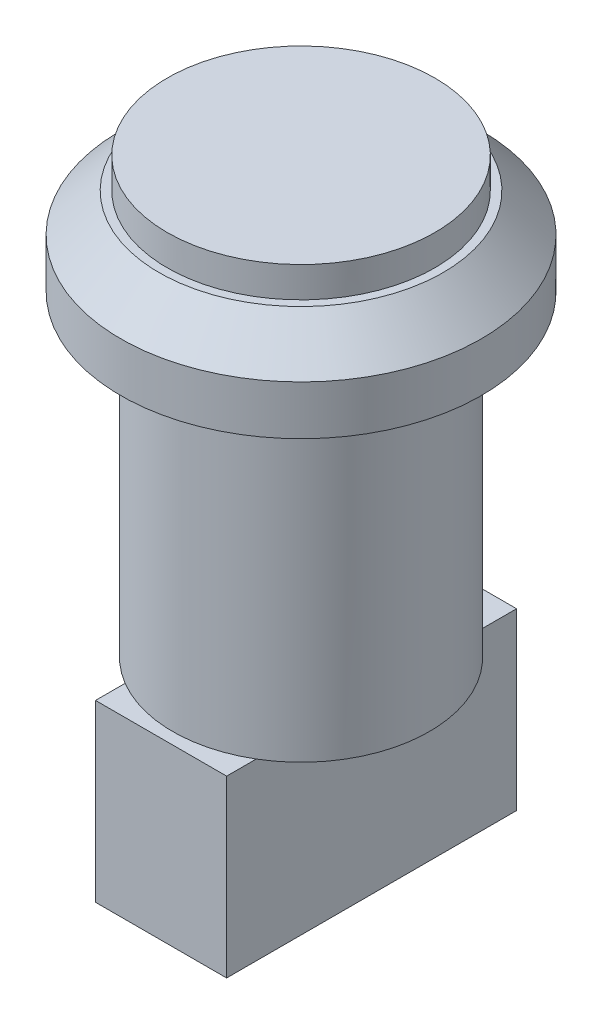
ISO-10303-21;
HEADER;
FILE_DESCRIPTION(('STEP AP214'),'2;1');
FILE_NAME('part.step','',(''),(''),'','','');
FILE_SCHEMA(('AUTOMOTIVE_DESIGN { 1 0 10303 214 1 1 1 1 }'));
ENDSEC;
DATA;
#1=APPLICATION_CONTEXT('core data for automotive mechanical design processes');
#2=APPLICATION_PROTOCOL_DEFINITION('international standard','automotive_design',2000,#1);
#3=PRODUCT_CONTEXT('',#1,'mechanical');
#4=PRODUCT('Part','Part','',(#3));
#5=PRODUCT_RELATED_PRODUCT_CATEGORY('part','',(#4));
#6=PRODUCT_DEFINITION_FORMATION('','',#4);
#7=PRODUCT_DEFINITION_CONTEXT('part definition',#1,'design');
#8=PRODUCT_DEFINITION('design','',#6,#7);
#9=PRODUCT_DEFINITION_SHAPE('','',#8);
#10=(LENGTH_UNIT() NAMED_UNIT(*) SI_UNIT(.MILLI.,.METRE.));
#11=(NAMED_UNIT(*) PLANE_ANGLE_UNIT() SI_UNIT($,.RADIAN.));
#12=(NAMED_UNIT(*) SI_UNIT($,.STERADIAN.) SOLID_ANGLE_UNIT());
#13=UNCERTAINTY_MEASURE_WITH_UNIT(LENGTH_MEASURE(1.E-05),#10,'distance_accuracy_value','');
#14=(GEOMETRIC_REPRESENTATION_CONTEXT(3) GLOBAL_UNCERTAINTY_ASSIGNED_CONTEXT((#13)) GLOBAL_UNIT_ASSIGNED_CONTEXT((#10,
#11,#12)) REPRESENTATION_CONTEXT('',''));
#15=CARTESIAN_POINT('',(0.,0.,0.));
#16=DIRECTION('',(0.,0.,1.));
#17=DIRECTION('',(1.,0.,0.));
#18=AXIS2_PLACEMENT_3D('',#15,#16,#17);
#19=CARTESIAN_POINT('',(0.,-37.,0.));
#20=DIRECTION('',(0.,-1.,0.));
#21=DIRECTION('',(0.,0.,-1.));
#22=AXIS2_PLACEMENT_3D('',#19,#20,#21);
#23=PLANE('',#22);
#24=DIRECTION('',(0.,0.,-1.));
#25=VECTOR('',#24,1.);
#26=CARTESIAN_POINT('',(-6.,-37.,12.8118333096289));
#27=LINE('',#26,#25);
#28=CARTESIAN_POINT('',(-6.,-37.,10.1025986755884));
#29=VERTEX_POINT('',#28);
#30=CARTESIAN_POINT('',(-6.,-37.,-10.1025986755884));
#31=VERTEX_POINT('',#30);
#32=EDGE_CURVE('E11',#29,#31,#27,.T.);
#33=ORIENTED_EDGE('',*,*,#32,.F.);
#34=CARTESIAN_POINT('',(0.,-37.,0.));
#35=DIRECTION('',(0.,-1.,0.));
#36=DIRECTION('',(0.,0.,-1.));
#37=AXIS2_PLACEMENT_3D('',#34,#35,#36);
#38=CIRCLE('',#37,11.75);
#39=EDGE_CURVE('E165',#29,#31,#38,.T.);
#40=ORIENTED_EDGE('',*,*,#39,.T.);
#41=EDGE_LOOP('',(#33,#40));
#42=FACE_BOUND('',#41,.T.);
#43=ADVANCED_FACE('F33',(#42),#23,.T.);
#44=CARTESIAN_POINT('',(0.,2.8,0.));
#45=DIRECTION('',(0.,-1.,0.));
#46=DIRECTION('',(0.,0.,-1.));
#47=AXIS2_PLACEMENT_3D('',#44,#45,#46);
#48=CYLINDRICAL_SURFACE('',#47,12.25);
#49=CARTESIAN_POINT('',(0.,2.8,0.));
#50=DIRECTION('',(0.,1.,0.));
#51=DIRECTION('',(0.,0.,1.));
#52=AXIS2_PLACEMENT_3D('',#49,#50,#51);
#53=CIRCLE('',#52,12.25);
#54=CARTESIAN_POINT('',(0.,2.8,12.25));
#55=VERTEX_POINT('',#54);
#56=EDGE_CURVE('E131',#55,#55,#53,.T.);
#57=ORIENTED_EDGE('',*,*,#56,.F.);
#58=EDGE_LOOP('',(#57));
#59=FACE_BOUND('',#58,.T.);
#60=CARTESIAN_POINT('',(0.,0.,0.));
#61=DIRECTION('',(0.,-1.,0.));
#62=DIRECTION('',(0.,0.,-1.));
#63=AXIS2_PLACEMENT_3D('',#60,#61,#62);
#64=CIRCLE('',#63,12.25);
#65=CARTESIAN_POINT('',(0.,0.,-12.25));
#66=VERTEX_POINT('',#65);
#67=EDGE_CURVE('E128',#66,#66,#64,.T.);
#68=ORIENTED_EDGE('',*,*,#67,.F.);
#69=EDGE_LOOP('',(#68));
#70=FACE_BOUND('',#69,.T.);
#71=ADVANCED_FACE('F180',(#59,#70),#48,.T.);
#72=CARTESIAN_POINT('',(0.,2.8,0.));
#73=DIRECTION('',(0.,1.,0.));
#74=DIRECTION('',(0.,0.,1.));
#75=AXIS2_PLACEMENT_3D('',#72,#73,#74);
#76=PLANE('',#75);
#77=ORIENTED_EDGE('',*,*,#56,.T.);
#78=EDGE_LOOP('',(#77));
#79=FACE_BOUND('',#78,.T.);
#80=ADVANCED_FACE('F185',(#79),#76,.T.);
#81=CARTESIAN_POINT('',(0.,-8.,0.));
#82=DIRECTION('',(0.,1.,0.));
#83=DIRECTION('',(0.,0.,1.));
#84=AXIS2_PLACEMENT_3D('',#81,#82,#83);
#85=CYLINDRICAL_SURFACE('',#84,16.5);
#86=CARTESIAN_POINT('',(0.,-3.5,0.));
#87=DIRECTION('',(0.,-1.,0.));
#88=DIRECTION('',(0.,0.,-1.));
#89=AXIS2_PLACEMENT_3D('',#86,#87,#88);
#90=CIRCLE('',#89,16.5);
#91=CARTESIAN_POINT('',(0.,-3.5,-16.5));
#92=VERTEX_POINT('',#91);
#93=EDGE_CURVE('E133',#92,#92,#90,.T.);
#94=ORIENTED_EDGE('',*,*,#93,.T.);
#95=EDGE_LOOP('',(#94));
#96=FACE_BOUND('',#95,.T.);
#97=CARTESIAN_POINT('',(0.,-8.,0.));
#98=DIRECTION('',(0.,-1.,0.));
#99=DIRECTION('',(0.,0.,-1.));
#100=AXIS2_PLACEMENT_3D('',#97,#98,#99);
#101=CIRCLE('',#100,16.5);
#102=CARTESIAN_POINT('',(0.,-8.,-16.5));
#103=VERTEX_POINT('',#102);
#104=EDGE_CURVE('E123',#103,#103,#101,.T.);
#105=ORIENTED_EDGE('',*,*,#104,.F.);
#106=EDGE_LOOP('',(#105));
#107=FACE_BOUND('',#106,.T.);
#108=ADVANCED_FACE('F201',(#96,#107),#85,.T.);
#109=CARTESIAN_POINT('',(0.,-8.,0.));
#110=DIRECTION('',(0.,-1.,0.));
#111=DIRECTION('',(0.,0.,-1.));
#112=AXIS2_PLACEMENT_3D('',#109,#110,#111);
#113=PLANE('',#112);
#114=CARTESIAN_POINT('',(0.,-8.,0.));
#115=DIRECTION('',(0.,-1.,0.));
#116=DIRECTION('',(0.,0.,-1.));
#117=AXIS2_PLACEMENT_3D('',#114,#115,#116);
#118=CIRCLE('',#117,11.75);
#119=CARTESIAN_POINT('',(0.,-8.,-11.75));
#120=VERTEX_POINT('',#119);
#121=EDGE_CURVE('E114',#120,#120,#118,.T.);
#122=ORIENTED_EDGE('',*,*,#121,.F.);
#123=EDGE_LOOP('',(#122));
#124=FACE_BOUND('',#123,.T.);
#125=ORIENTED_EDGE('',*,*,#104,.T.);
#126=EDGE_LOOP('',(#125));
#127=FACE_BOUND('',#126,.T.);
#128=ADVANCED_FACE('F197',(#124,#127),#113,.T.);
#129=CARTESIAN_POINT('',(0.,0.,0.));
#130=DIRECTION('',(0.,-1.,0.));
#131=DIRECTION('',(0.,0.,-1.));
#132=AXIS2_PLACEMENT_3D('',#129,#130,#131);
#133=PLANE('',#132);
#134=CARTESIAN_POINT('',(0.,0.,0.));
#135=DIRECTION('',(0.,-1.,0.));
#136=DIRECTION('',(0.,0.,-1.));
#137=AXIS2_PLACEMENT_3D('',#134,#135,#136);
#138=CIRCLE('',#137,13.);
#139=CARTESIAN_POINT('',(0.,0.,-13.));
#140=VERTEX_POINT('',#139);
#141=EDGE_CURVE('E37',#140,#140,#138,.F.);
#142=ORIENTED_EDGE('',*,*,#141,.T.);
#143=EDGE_LOOP('',(#142));
#144=FACE_BOUND('',#143,.T.);
#145=ORIENTED_EDGE('',*,*,#67,.T.);
#146=EDGE_LOOP('',(#145));
#147=FACE_BOUND('',#146,.T.);
#148=ADVANCED_FACE('F200',(#144,#147),#133,.F.);
#149=CARTESIAN_POINT('',(0.,-3.5,0.));
#150=DIRECTION('',(0.,-1.,0.));
#151=DIRECTION('',(0.,0.,-1.));
#152=AXIS2_PLACEMENT_3D('',#149,#150,#151);
#153=CONICAL_SURFACE('',#152,16.5,0.78539816339745);
#154=CARTESIAN_POINT('',(0.,0.,-13.));
#155=CARTESIAN_POINT('',(0.,-0.0364583333333329,-13.0364583333333));
#156=CARTESIAN_POINT('',(0.,-0.0729166666666663,-13.0729166666667));
#157=CARTESIAN_POINT('',(0.,-0.145833333333333,-13.1458333333333));
#158=CARTESIAN_POINT('',(0.,-0.182291666666666,-13.1822916666667));
#159=CARTESIAN_POINT('',(0.,-0.255208333333333,-13.2552083333333));
#160=CARTESIAN_POINT('',(0.,-0.291666666666666,-13.2916666666667));
#161=CARTESIAN_POINT('',(0.,-0.364583333333333,-13.3645833333333));
#162=CARTESIAN_POINT('',(0.,-0.401041666666666,-13.4010416666667));
#163=CARTESIAN_POINT('',(0.,-0.473958333333333,-13.4739583333333));
#164=CARTESIAN_POINT('',(0.,-0.510416666666666,-13.5104166666667));
#165=CARTESIAN_POINT('',(0.,-0.583333333333333,-13.5833333333333));
#166=CARTESIAN_POINT('',(0.,-0.619791666666667,-13.6197916666667));
#167=CARTESIAN_POINT('',(0.,-0.692708333333333,-13.6927083333333));
#168=CARTESIAN_POINT('',(0.,-0.729166666666666,-13.7291666666667));
#169=CARTESIAN_POINT('',(0.,-0.802083333333332,-13.8020833333333));
#170=CARTESIAN_POINT('',(0.,-0.838541666666666,-13.8385416666667));
#171=CARTESIAN_POINT('',(0.,-0.911458333333333,-13.9114583333333));
#172=CARTESIAN_POINT('',(0.,-0.947916666666666,-13.9479166666667));
#173=CARTESIAN_POINT('',(0.,-1.02083333333333,-14.0208333333333));
#174=CARTESIAN_POINT('',(0.,-1.05729166666667,-14.0572916666667));
#175=CARTESIAN_POINT('',(0.,-1.13020833333333,-14.1302083333333));
#176=CARTESIAN_POINT('',(0.,-1.16666666666667,-14.1666666666667));
#177=CARTESIAN_POINT('',(0.,-1.23958333333333,-14.2395833333333));
#178=CARTESIAN_POINT('',(0.,-1.27604166666667,-14.2760416666667));
#179=CARTESIAN_POINT('',(0.,-1.34895833333333,-14.3489583333333));
#180=CARTESIAN_POINT('',(0.,-1.38541666666667,-14.3854166666667));
#181=CARTESIAN_POINT('',(0.,-1.45833333333333,-14.4583333333333));
#182=CARTESIAN_POINT('',(0.,-1.49479166666667,-14.4947916666667));
#183=CARTESIAN_POINT('',(0.,-1.56770833333333,-14.5677083333333));
#184=CARTESIAN_POINT('',(0.,-1.60416666666667,-14.6041666666667));
#185=CARTESIAN_POINT('',(0.,-1.67708333333333,-14.6770833333333));
#186=CARTESIAN_POINT('',(0.,-1.71354166666667,-14.7135416666667));
#187=CARTESIAN_POINT('',(0.,-1.78645833333333,-14.7864583333333));
#188=CARTESIAN_POINT('',(0.,-1.82291666666667,-14.8229166666667));
#189=CARTESIAN_POINT('',(0.,-1.89583333333333,-14.8958333333333));
#190=CARTESIAN_POINT('',(0.,-1.93229166666667,-14.9322916666667));
#191=CARTESIAN_POINT('',(0.,-2.00520833333333,-15.0052083333333));
#192=CARTESIAN_POINT('',(0.,-2.04166666666667,-15.0416666666667));
#193=CARTESIAN_POINT('',(0.,-2.11458333333333,-15.1145833333333));
#194=CARTESIAN_POINT('',(0.,-2.15104166666667,-15.1510416666667));
#195=CARTESIAN_POINT('',(0.,-2.22395833333333,-15.2239583333333));
#196=CARTESIAN_POINT('',(0.,-2.26041666666667,-15.2604166666667));
#197=CARTESIAN_POINT('',(0.,-2.33333333333333,-15.3333333333333));
#198=CARTESIAN_POINT('',(0.,-2.36979166666667,-15.3697916666667));
#199=CARTESIAN_POINT('',(0.,-2.44270833333333,-15.4427083333333));
#200=CARTESIAN_POINT('',(0.,-2.47916666666667,-15.4791666666667));
#201=CARTESIAN_POINT('',(0.,-2.55208333333333,-15.5520833333333));
#202=CARTESIAN_POINT('',(0.,-2.58854166666667,-15.5885416666667));
#203=CARTESIAN_POINT('',(0.,-2.66145833333333,-15.6614583333333));
#204=CARTESIAN_POINT('',(0.,-2.69791666666667,-15.6979166666667));
#205=CARTESIAN_POINT('',(0.,-2.77083333333333,-15.7708333333333));
#206=CARTESIAN_POINT('',(0.,-2.80729166666667,-15.8072916666667));
#207=CARTESIAN_POINT('',(0.,-2.88020833333333,-15.8802083333333));
#208=CARTESIAN_POINT('',(0.,-2.91666666666667,-15.9166666666667));
#209=CARTESIAN_POINT('',(0.,-2.98958333333333,-15.9895833333333));
#210=CARTESIAN_POINT('',(0.,-3.02604166666667,-16.0260416666667));
#211=CARTESIAN_POINT('',(0.,-3.09895833333333,-16.0989583333333));
#212=CARTESIAN_POINT('',(0.,-3.13541666666667,-16.1354166666667));
#213=CARTESIAN_POINT('',(0.,-3.20833333333333,-16.2083333333333));
#214=CARTESIAN_POINT('',(0.,-3.24479166666667,-16.2447916666667));
#215=CARTESIAN_POINT('',(0.,-3.31770833333333,-16.3177083333333));
#216=CARTESIAN_POINT('',(0.,-3.35416666666667,-16.3541666666667));
#217=CARTESIAN_POINT('',(0.,-3.42708333333333,-16.4270833333333));
#218=CARTESIAN_POINT('',(0.,-3.46354166666667,-16.4635416666667));
#219=CARTESIAN_POINT('',(0.,-3.5,-16.5));
#220=B_SPLINE_CURVE_WITH_KNOTS('',3,(#154,#155,#156,#157,#158,#159,#160,#161,#162,#163,#164,
#165,#166,#167,#168,#169,#170,#171,#172,#173,#174,#175,#176,#177,#178,#179,#180,#181,#182,#183,
#184,#185,#186,#187,#188,#189,#190,#191,#192,#193,#194,#195,#196,#197,#198,#199,#200,#201,#202,
#203,#204,#205,#206,#207,#208,#209,#210,#211,#212,#213,#214,#215,#216,#217,#218,#219),
.UNSPECIFIED.,.F.,.F.,(4,2,2,2,2,2,2,2,2,2,2,2,2,2,2,2,2,2,2,2,2,2,2,2,2,2,2,2,2,2,2,2,4),(0.,
0.154679608384557,0.309359216769115,0.464038825153672,0.618718433538229,0.773398041922787,
0.928077650307344,1.0827572586919,1.23743686707646,1.39211647546102,1.54679608384557,
1.70147569223013,1.85615530061469,2.01083490899925,2.1655145173838,2.32019412576836,
2.47487373415292,2.62955334253748,2.78423295092203,2.93891255930659,3.09359216769115,
3.24827177607571,3.40295138446026,3.55763099284482,3.71231060122938,3.86699020961394,
4.02166981799849,4.17634942638305,4.33102903476761,4.48570864315217,4.64038825153672,
4.79506785992128,4.94974746830584),.UNSPECIFIED.);
#221=EDGE_CURVE('BSEAM35',#140,#92,#220,.T.);
#222=ORIENTED_EDGE('',*,*,#141,.F.);
#223=ORIENTED_EDGE('',*,*,#93,.F.);
#224=ORIENTED_EDGE('',*,*,#221,.T.);
#225=ORIENTED_EDGE('',*,*,#221,.F.);
#226=EDGE_LOOP('',(#222,#224,#223,#225));
#227=FACE_BOUND('',#226,.T.);
#228=ADVANCED_FACE('F35',(#227),#153,.T.);
#229=CARTESIAN_POINT('',(0.,-37.,0.));
#230=DIRECTION('',(0.,1.,0.));
#231=DIRECTION('',(0.,0.,1.));
#232=AXIS2_PLACEMENT_3D('',#229,#230,#231);
#233=CYLINDRICAL_SURFACE('',#232,11.75);
#234=CARTESIAN_POINT('',(6.,-37.,-10.1025986755884));
#235=VERTEX_POINT('',#234);
#236=CARTESIAN_POINT('',(6.,-37.,10.1025986755884));
#237=VERTEX_POINT('',#236);
#238=EDGE_CURVE('E122',#235,#237,#38,.T.);
#239=ORIENTED_EDGE('',*,*,#238,.F.);
#240=EDGE_CURVE('E52',#31,#235,#38,.T.);
#241=ORIENTED_EDGE('',*,*,#240,.F.);
#242=ORIENTED_EDGE('',*,*,#39,.F.);
#243=EDGE_CURVE('E124',#237,#29,#38,.T.);
#244=ORIENTED_EDGE('',*,*,#243,.F.);
#245=EDGE_LOOP('',(#239,#241,#242,#244));
#246=FACE_BOUND('',#245,.T.);
#247=ORIENTED_EDGE('',*,*,#121,.T.);
#248=EDGE_LOOP('',(#247));
#249=FACE_BOUND('',#248,.T.);
#250=ADVANCED_FACE('F189',(#246,#249),#233,.T.);
#251=DIRECTION('',(0.,0.,1.));
#252=VECTOR('',#251,1.);
#253=CARTESIAN_POINT('',(6.,-37.,12.8118333096289));
#254=LINE('',#253,#252);
#255=EDGE_CURVE('E42',#235,#237,#254,.T.);
#256=ORIENTED_EDGE('',*,*,#255,.F.);
#257=ORIENTED_EDGE('',*,*,#238,.T.);
#258=EDGE_LOOP('',(#256,#257));
#259=FACE_BOUND('',#258,.T.);
#260=ADVANCED_FACE('F176',(#259),#23,.T.);
#261=CARTESIAN_POINT('',(0.,-37.,0.));
#262=DIRECTION('',(0.,-1.,0.));
#263=DIRECTION('',(0.,0.,-1.));
#264=AXIS2_PLACEMENT_3D('',#261,#262,#263);
#265=PLANE('',#264);
#266=CARTESIAN_POINT('',(6.,-37.,12.8118333096289));
#267=VERTEX_POINT('',#266);
#268=EDGE_CURVE('E143',#237,#267,#254,.T.);
#269=ORIENTED_EDGE('',*,*,#268,.F.);
#270=ORIENTED_EDGE('',*,*,#243,.T.);
#271=CARTESIAN_POINT('',(-6.,-37.,12.8118333096289));
#272=VERTEX_POINT('',#271);
#273=EDGE_CURVE('E44',#272,#29,#27,.T.);
#274=ORIENTED_EDGE('',*,*,#273,.F.);
#275=DIRECTION('',(-1.,0.,0.));
#276=VECTOR('',#275,1.);
#277=CARTESIAN_POINT('',(-6.,-37.,12.8118333096289));
#278=LINE('',#277,#276);
#279=EDGE_CURVE('E108',#267,#272,#278,.T.);
#280=ORIENTED_EDGE('',*,*,#279,.F.);
#281=EDGE_LOOP('',(#269,#270,#274,#280));
#282=FACE_BOUND('',#281,.T.);
#283=ADVANCED_FACE('F163',(#282),#265,.F.);
#284=CARTESIAN_POINT('',(-6.,-37.,-13.7220878964584));
#285=VERTEX_POINT('',#284);
#286=EDGE_CURVE('E45',#31,#285,#27,.T.);
#287=ORIENTED_EDGE('',*,*,#286,.F.);
#288=ORIENTED_EDGE('',*,*,#240,.T.);
#289=CARTESIAN_POINT('',(6.,-37.,-13.7220878964584));
#290=VERTEX_POINT('',#289);
#291=EDGE_CURVE('E142',#290,#235,#254,.T.);
#292=ORIENTED_EDGE('',*,*,#291,.F.);
#293=DIRECTION('',(1.,0.,0.));
#294=VECTOR('',#293,1.);
#295=CARTESIAN_POINT('',(-6.,-37.,-13.7220878964584));
#296=LINE('',#295,#294);
#297=EDGE_CURVE('E148',#285,#290,#296,.T.);
#298=ORIENTED_EDGE('',*,*,#297,.F.);
#299=EDGE_LOOP('',(#287,#288,#292,#298));
#300=FACE_BOUND('',#299,.T.);
#301=ADVANCED_FACE('F168',(#300),#265,.F.);
#302=CARTESIAN_POINT('',(-6.,-53.,12.8118333096289));
#303=DIRECTION('',(1.,0.,0.));
#304=DIRECTION('',(0.,0.,-1.));
#305=AXIS2_PLACEMENT_3D('',#302,#303,#304);
#306=PLANE('',#305);
#307=ORIENTED_EDGE('',*,*,#273,.T.);
#308=ORIENTED_EDGE('',*,*,#32,.T.);
#309=ORIENTED_EDGE('',*,*,#286,.T.);
#310=DIRECTION('',(0.,1.,0.));
#311=VECTOR('',#310,1.);
#312=CARTESIAN_POINT('',(-6.,-53.,-13.7220878964584));
#313=LINE('',#312,#311);
#314=CARTESIAN_POINT('',(-6.,-53.,-13.7220878964584));
#315=VERTEX_POINT('',#314);
#316=EDGE_CURVE('E93',#315,#285,#313,.T.);
#317=ORIENTED_EDGE('',*,*,#316,.F.);
#318=DIRECTION('',(0.,0.,-1.));
#319=VECTOR('',#318,1.);
#320=CARTESIAN_POINT('',(-6.,-53.,12.8118333096289));
#321=LINE('',#320,#319);
#322=CARTESIAN_POINT('',(-6.,-53.,12.8118333096289));
#323=VERTEX_POINT('',#322);
#324=EDGE_CURVE('E99',#323,#315,#321,.T.);
#325=ORIENTED_EDGE('',*,*,#324,.F.);
#326=DIRECTION('',(0.,1.,0.));
#327=VECTOR('',#326,1.);
#328=CARTESIAN_POINT('',(-6.,-53.,12.8118333096289));
#329=LINE('',#328,#327);
#330=EDGE_CURVE('E154',#323,#272,#329,.T.);
#331=ORIENTED_EDGE('',*,*,#330,.T.);
#332=EDGE_LOOP('',(#307,#308,#309,#317,#325,#331));
#333=FACE_BOUND('',#332,.T.);
#334=ADVANCED_FACE('F111',(#333),#306,.F.);
#335=CARTESIAN_POINT('',(-6.,-53.,-13.7220878964584));
#336=DIRECTION('',(0.,0.,1.));
#337=DIRECTION('',(1.,0.,0.));
#338=AXIS2_PLACEMENT_3D('',#335,#336,#337);
#339=PLANE('',#338);
#340=ORIENTED_EDGE('',*,*,#297,.T.);
#341=DIRECTION('',(0.,1.,0.));
#342=VECTOR('',#341,1.);
#343=CARTESIAN_POINT('',(6.,-53.,-13.7220878964584));
#344=LINE('',#343,#342);
#345=CARTESIAN_POINT('',(6.,-53.,-13.7220878964584));
#346=VERTEX_POINT('',#345);
#347=EDGE_CURVE('E95',#346,#290,#344,.T.);
#348=ORIENTED_EDGE('',*,*,#347,.F.);
#349=DIRECTION('',(1.,0.,0.));
#350=VECTOR('',#349,1.);
#351=CARTESIAN_POINT('',(-6.,-53.,-13.7220878964584));
#352=LINE('',#351,#350);
#353=EDGE_CURVE('E89',#315,#346,#352,.T.);
#354=ORIENTED_EDGE('',*,*,#353,.F.);
#355=ORIENTED_EDGE('',*,*,#316,.T.);
#356=EDGE_LOOP('',(#340,#348,#354,#355));
#357=FACE_BOUND('',#356,.T.);
#358=ADVANCED_FACE('F91',(#357),#339,.F.);
#359=CARTESIAN_POINT('',(6.,-53.,12.8118333096289));
#360=DIRECTION('',(-1.,0.,0.));
#361=DIRECTION('',(0.,0.,1.));
#362=AXIS2_PLACEMENT_3D('',#359,#360,#361);
#363=PLANE('',#362);
#364=ORIENTED_EDGE('',*,*,#291,.T.);
#365=ORIENTED_EDGE('',*,*,#255,.T.);
#366=ORIENTED_EDGE('',*,*,#268,.T.);
#367=DIRECTION('',(0.,1.,0.));
#368=VECTOR('',#367,1.);
#369=CARTESIAN_POINT('',(6.,-53.,12.8118333096289));
#370=LINE('',#369,#368);
#371=CARTESIAN_POINT('',(6.,-53.,12.8118333096289));
#372=VERTEX_POINT('',#371);
#373=EDGE_CURVE('E118',#372,#267,#370,.T.);
#374=ORIENTED_EDGE('',*,*,#373,.F.);
#375=DIRECTION('',(0.,0.,1.));
#376=VECTOR('',#375,1.);
#377=CARTESIAN_POINT('',(6.,-53.,12.8118333096289));
#378=LINE('',#377,#376);
#379=EDGE_CURVE('E98',#346,#372,#378,.T.);
#380=ORIENTED_EDGE('',*,*,#379,.F.);
#381=ORIENTED_EDGE('',*,*,#347,.T.);
#382=EDGE_LOOP('',(#364,#365,#366,#374,#380,#381));
#383=FACE_BOUND('',#382,.T.);
#384=ADVANCED_FACE('F155',(#383),#363,.F.);
#385=CARTESIAN_POINT('',(-6.,-53.,12.8118333096289));
#386=DIRECTION('',(0.,0.,-1.));
#387=DIRECTION('',(-1.,0.,0.));
#388=AXIS2_PLACEMENT_3D('',#385,#386,#387);
#389=PLANE('',#388);
#390=ORIENTED_EDGE('',*,*,#279,.T.);
#391=ORIENTED_EDGE('',*,*,#330,.F.);
#392=DIRECTION('',(-1.,0.,0.));
#393=VECTOR('',#392,1.);
#394=CARTESIAN_POINT('',(-6.,-53.,12.8118333096289));
#395=LINE('',#394,#393);
#396=EDGE_CURVE('E104',#372,#323,#395,.T.);
#397=ORIENTED_EDGE('',*,*,#396,.F.);
#398=ORIENTED_EDGE('',*,*,#373,.T.);
#399=EDGE_LOOP('',(#390,#391,#397,#398));
#400=FACE_BOUND('',#399,.T.);
#401=ADVANCED_FACE('F158',(#400),#389,.F.);
#402=CARTESIAN_POINT('',(0.,-53.,0.));
#403=DIRECTION('',(0.,-1.,0.));
#404=DIRECTION('',(0.,0.,-1.));
#405=AXIS2_PLACEMENT_3D('',#402,#403,#404);
#406=PLANE('',#405);
#407=ORIENTED_EDGE('',*,*,#324,.T.);
#408=ORIENTED_EDGE('',*,*,#353,.T.);
#409=ORIENTED_EDGE('',*,*,#379,.T.);
#410=ORIENTED_EDGE('',*,*,#396,.T.);
#411=EDGE_LOOP('',(#407,#408,#409,#410));
#412=FACE_BOUND('',#411,.T.);
#413=ADVANCED_FACE('F102',(#412),#406,.T.);
#414=CLOSED_SHELL('',(#43,#71,#80,#108,#128,#148,#228,#250,#260,#283,#301,#334,#358,#384,#401,#413));
#415=MANIFOLD_SOLID_BREP('B2',#414);
#416=ADVANCED_BREP_SHAPE_REPRESENTATION('',(#18,#415),#14);
#417=SHAPE_DEFINITION_REPRESENTATION(#9,#416);
ENDSEC;
END-ISO-10303-21;
